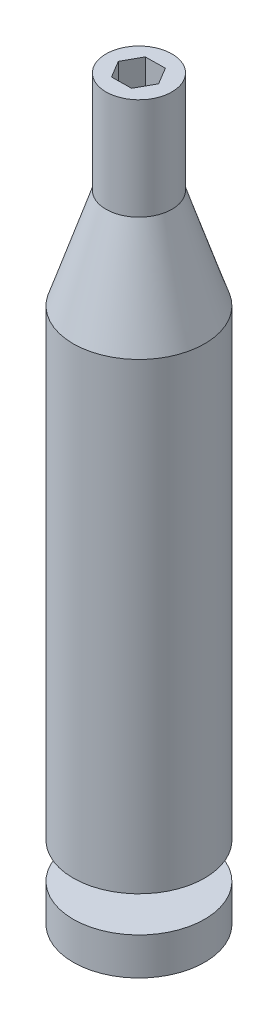
ISO-10303-21;
HEADER;
FILE_DESCRIPTION(('STEP AP214'),'2;1');
FILE_NAME('part.step','',(''),(''),'','','');
FILE_SCHEMA(('AUTOMOTIVE_DESIGN { 1 0 10303 214 1 1 1 1 }'));
ENDSEC;
DATA;
#1=APPLICATION_CONTEXT('core data for automotive mechanical design processes');
#2=APPLICATION_PROTOCOL_DEFINITION('international standard','automotive_design',2000,#1);
#3=PRODUCT_CONTEXT('',#1,'mechanical');
#4=PRODUCT('Part','Part','',(#3));
#5=PRODUCT_RELATED_PRODUCT_CATEGORY('part','',(#4));
#6=PRODUCT_DEFINITION_FORMATION('','',#4);
#7=PRODUCT_DEFINITION_CONTEXT('part definition',#1,'design');
#8=PRODUCT_DEFINITION('design','',#6,#7);
#9=PRODUCT_DEFINITION_SHAPE('','',#8);
#10=(LENGTH_UNIT() NAMED_UNIT(*) SI_UNIT(.MILLI.,.METRE.));
#11=(NAMED_UNIT(*) PLANE_ANGLE_UNIT() SI_UNIT($,.RADIAN.));
#12=(NAMED_UNIT(*) SI_UNIT($,.STERADIAN.) SOLID_ANGLE_UNIT());
#13=UNCERTAINTY_MEASURE_WITH_UNIT(LENGTH_MEASURE(1.E-05),#10,'distance_accuracy_value','');
#14=(GEOMETRIC_REPRESENTATION_CONTEXT(3) GLOBAL_UNCERTAINTY_ASSIGNED_CONTEXT((#13)) GLOBAL_UNIT_ASSIGNED_CONTEXT((#10,
#11,#12)) REPRESENTATION_CONTEXT('',''));
#15=CARTESIAN_POINT('',(0.,0.,0.));
#16=DIRECTION('',(0.,0.,1.));
#17=DIRECTION('',(1.,0.,0.));
#18=AXIS2_PLACEMENT_3D('',#15,#16,#17);
#19=CARTESIAN_POINT('',(0.,-70.3453569178805,0.));
#20=DIRECTION('',(0.,-1.,0.));
#21=DIRECTION('',(0.,0.,-1.));
#22=AXIS2_PLACEMENT_3D('',#19,#20,#21);
#23=PLANE('',#22);
#24=CARTESIAN_POINT('',(-35.1618275784359,-70.3453569178805,0.));
#25=DIRECTION('',(0.,1.,0.));
#26=DIRECTION('',(0.,0.,1.));
#27=AXIS2_PLACEMENT_3D('',#24,#25,#26);
#28=CIRCLE('',#27,1.29726463423902);
#29=CARTESIAN_POINT('',(-35.1618275784359,-70.3453569178805,1.29726463423902));
#30=VERTEX_POINT('',#29);
#31=EDGE_CURVE('E71',#30,#30,#28,.T.);
#32=ORIENTED_EDGE('',*,*,#31,.T.);
#33=EDGE_LOOP('',(#32));
#34=FACE_BOUND('',#33,.T.);
#35=ADVANCED_FACE('F49',(#34),#23,.F.);
#36=CARTESIAN_POINT('',(0.,-119.615434083961,0.));
#37=DIRECTION('',(0.,-1.,0.));
#38=DIRECTION('',(0.,0.,-1.));
#39=AXIS2_PLACEMENT_3D('',#36,#37,#38);
#40=PLANE('',#39);
#41=CARTESIAN_POINT('',(-35.1618275784359,-119.615434083961,0.));
#42=DIRECTION('',(0.,1.,0.));
#43=DIRECTION('',(0.,0.,1.));
#44=AXIS2_PLACEMENT_3D('',#41,#42,#43);
#45=CIRCLE('',#44,10.9373759724036);
#46=CARTESIAN_POINT('',(-35.1618275784359,-119.615434083961,10.9373759724036));
#47=VERTEX_POINT('',#46);
#48=EDGE_CURVE('E11',#47,#47,#45,.T.);
#49=ORIENTED_EDGE('',*,*,#48,.F.);
#50=EDGE_LOOP('',(#49));
#51=FACE_BOUND('',#50,.T.);
#52=ADVANCED_FACE('F101',(#51),#40,.T.);
#53=CARTESIAN_POINT('',(-35.1618275784359,36.0557723473792,0.));
#54=DIRECTION('',(0.,1.,0.));
#55=DIRECTION('',(0.,0.,1.));
#56=AXIS2_PLACEMENT_3D('',#53,#54,#55);
#57=CYLINDRICAL_SURFACE('',#56,10.9373759724036);
#58=ORIENTED_EDGE('',*,*,#48,.T.);
#59=EDGE_LOOP('',(#58));
#60=FACE_BOUND('',#59,.T.);
#61=CARTESIAN_POINT('',(-35.1618275784359,-113.408967551433,0.));
#62=DIRECTION('',(0.,1.,0.));
#63=DIRECTION('',(0.,0.,1.));
#64=AXIS2_PLACEMENT_3D('',#61,#62,#63);
#65=CIRCLE('',#64,10.9373759724036);
#66=CARTESIAN_POINT('',(-35.1618275784359,-113.408967551433,10.9373759724036));
#67=VERTEX_POINT('',#66);
#68=EDGE_CURVE('E55',#67,#67,#65,.T.);
#69=ORIENTED_EDGE('',*,*,#68,.F.);
#70=EDGE_LOOP('',(#69));
#71=FACE_BOUND('',#70,.T.);
#72=ADVANCED_FACE('F96',(#60,#71),#57,.T.);
#73=CARTESIAN_POINT('',(1.76362048735651E-13,-113.408967551433,0.));
#74=DIRECTION('',(0.,-1.,0.));
#75=DIRECTION('',(0.,0.,-1.));
#76=AXIS2_PLACEMENT_3D('',#73,#74,#75);
#77=PLANE('',#76);
#78=CARTESIAN_POINT('',(-35.1618275784359,-113.408967551433,0.));
#79=DIRECTION('',(0.,1.,0.));
#80=DIRECTION('',(0.,0.,1.));
#81=AXIS2_PLACEMENT_3D('',#78,#79,#80);
#82=CIRCLE('',#81,2.01331550437638);
#83=CARTESIAN_POINT('',(-35.1618275784359,-113.408967551433,2.01331550437638));
#84=VERTEX_POINT('',#83);
#85=EDGE_CURVE('E59',#84,#84,#82,.T.);
#86=ORIENTED_EDGE('',*,*,#85,.F.);
#87=EDGE_LOOP('',(#86));
#88=FACE_BOUND('',#87,.T.);
#89=ORIENTED_EDGE('',*,*,#68,.T.);
#90=EDGE_LOOP('',(#89));
#91=FACE_BOUND('',#90,.T.);
#92=ADVANCED_FACE('F91',(#88,#91),#77,.F.);
#93=CARTESIAN_POINT('',(-35.1618275784359,36.0557723473792,0.));
#94=DIRECTION('',(0.,1.,0.));
#95=DIRECTION('',(0.,0.,1.));
#96=AXIS2_PLACEMENT_3D('',#93,#94,#95);
#97=CYLINDRICAL_SURFACE('',#96,2.01331550437637);
#98=CARTESIAN_POINT('',(-35.1618275784359,-75.528254617628,0.));
#99=DIRECTION('',(0.,1.,0.));
#100=DIRECTION('',(0.,0.,1.));
#101=AXIS2_PLACEMENT_3D('',#98,#99,#100);
#102=CIRCLE('',#101,2.01331550437637);
#103=CARTESIAN_POINT('',(-35.1618275784359,-75.5282546176281,2.01331550437636));
#104=VERTEX_POINT('',#103);
#105=EDGE_CURVE('E63',#104,#104,#102,.T.);
#106=ORIENTED_EDGE('',*,*,#105,.F.);
#107=EDGE_LOOP('',(#106));
#108=FACE_BOUND('',#107,.T.);
#109=ORIENTED_EDGE('',*,*,#85,.T.);
#110=EDGE_LOOP('',(#109));
#111=FACE_BOUND('',#110,.T.);
#112=ADVANCED_FACE('F85',(#108,#111),#97,.T.);
#113=CARTESIAN_POINT('',(-35.1618275784359,-75.528254617628,0.));
#114=DIRECTION('',(0.,1.,0.));
#115=DIRECTION('',(0.,0.,1.));
#116=AXIS2_PLACEMENT_3D('',#113,#114,#115);
#117=CONICAL_SURFACE('',#116,2.01331550437637,0.904722407207791);
#118=CARTESIAN_POINT('',(-35.1618275784359,-71.8554377448549,0.));
#119=DIRECTION('',(0.,1.,0.));
#120=DIRECTION('',(0.,0.,1.));
#121=AXIS2_PLACEMENT_3D('',#118,#119,#120);
#122=CIRCLE('',#121,6.68680256993768);
#123=CARTESIAN_POINT('',(-35.1618275784359,-71.8554377448549,6.68680256993767));
#124=VERTEX_POINT('',#123);
#125=EDGE_CURVE('E68',#124,#124,#122,.T.);
#126=CARTESIAN_POINT('',(-35.1618275784359,-71.8554377448549,6.68680256993767));
#127=CARTESIAN_POINT('',(-35.1618275784359,-71.8936962539463,6.63812041300473));
#128=CARTESIAN_POINT('',(-35.1618275784359,-71.9319547630377,6.58943825607181));
#129=CARTESIAN_POINT('',(-35.1618275784359,-72.0084717812205,6.49207394220595));
#130=CARTESIAN_POINT('',(-35.1618275784359,-72.0467302903119,6.44339178527302));
#131=CARTESIAN_POINT('',(-35.1618275784359,-72.1232473084946,6.34602747140716));
#132=CARTESIAN_POINT('',(-35.1618275784359,-72.161505817586,6.29734531447422));
#133=CARTESIAN_POINT('',(-35.1618275784359,-72.2380228357688,6.19998100060836));
#134=CARTESIAN_POINT('',(-35.1618275784359,-72.2762813448602,6.15129884367543));
#135=CARTESIAN_POINT('',(-35.1618275784359,-72.352798363043,6.05393452980957));
#136=CARTESIAN_POINT('',(-35.1618275784359,-72.3910568721343,6.00525237287664));
#137=CARTESIAN_POINT('',(-35.1618275784359,-72.4675738903171,5.90788805901078));
#138=CARTESIAN_POINT('',(-35.1618275784359,-72.5058323994085,5.85920590207785));
#139=CARTESIAN_POINT('',(-35.1618275784359,-72.5823494175913,5.76184158821199));
#140=CARTESIAN_POINT('',(-35.1618275784359,-72.6206079266827,5.71315943127906));
#141=CARTESIAN_POINT('',(-35.1618275784359,-72.6971249448654,5.6157951174132));
#142=CARTESIAN_POINT('',(-35.1618275784359,-72.7353834539568,5.56711296048027));
#143=CARTESIAN_POINT('',(-35.1618275784359,-72.8119004721396,5.46974864661441));
#144=CARTESIAN_POINT('',(-35.1618275784359,-72.850158981231,5.42106648968148));
#145=CARTESIAN_POINT('',(-35.1618275784359,-72.9266759994138,5.32370217581562));
#146=CARTESIAN_POINT('',(-35.1618275784359,-72.9649345085051,5.27502001888269));
#147=CARTESIAN_POINT('',(-35.1618275784359,-73.0414515266879,5.17765570501683));
#148=CARTESIAN_POINT('',(-35.1618275784359,-73.0797100357793,5.1289735480839));
#149=CARTESIAN_POINT('',(-35.1618275784359,-73.1562270539621,5.03160923421804));
#150=CARTESIAN_POINT('',(-35.1618275784359,-73.1944855630534,4.98292707728511));
#151=CARTESIAN_POINT('',(-35.1618275784359,-73.2710025812362,4.88556276341925));
#152=CARTESIAN_POINT('',(-35.1618275784359,-73.3092610903276,4.83688060648631));
#153=CARTESIAN_POINT('',(-35.1618275784359,-73.3857781085104,4.73951629262045));
#154=CARTESIAN_POINT('',(-35.1618275784359,-73.4240366176018,4.69083413568753));
#155=CARTESIAN_POINT('',(-35.1618275784359,-73.5005536357845,4.59346982182167));
#156=CARTESIAN_POINT('',(-35.1618275784359,-73.5388121448759,4.54478766488873));
#157=CARTESIAN_POINT('',(-35.1618275784359,-73.6153291630587,4.44742335102287));
#158=CARTESIAN_POINT('',(-35.1618275784359,-73.6535876721501,4.39874119408994));
#159=CARTESIAN_POINT('',(-35.1618275784359,-73.7301046903329,4.30137688022408));
#160=CARTESIAN_POINT('',(-35.1618275784359,-73.7683631994243,4.25269472329115));
#161=CARTESIAN_POINT('',(-35.1618275784359,-73.844880217607,4.15533040942529));
#162=CARTESIAN_POINT('',(-35.1618275784359,-73.8831387266984,4.10664825249236));
#163=CARTESIAN_POINT('',(-35.1618275784359,-73.9596557448812,4.0092839386265));
#164=CARTESIAN_POINT('',(-35.1618275784359,-73.9979142539726,3.96060178169357));
#165=CARTESIAN_POINT('',(-35.1618275784359,-74.0744312721554,3.86323746782771));
#166=CARTESIAN_POINT('',(-35.1618275784359,-74.1126897812467,3.81455531089478));
#167=CARTESIAN_POINT('',(-35.1618275784359,-74.1892067994295,3.71719099702892));
#168=CARTESIAN_POINT('',(-35.1618275784359,-74.2274653085209,3.66850884009599));
#169=CARTESIAN_POINT('',(-35.1618275784359,-74.3039823267037,3.57114452623013));
#170=CARTESIAN_POINT('',(-35.1618275784359,-74.3422408357951,3.5224623692972));
#171=CARTESIAN_POINT('',(-35.1618275784359,-74.4187578539778,3.42509805543134));
#172=CARTESIAN_POINT('',(-35.1618275784359,-74.4570163630692,3.37641589849841));
#173=CARTESIAN_POINT('',(-35.1618275784359,-74.533533381252,3.27905158463255));
#174=CARTESIAN_POINT('',(-35.1618275784359,-74.5717918903434,3.23036942769962));
#175=CARTESIAN_POINT('',(-35.1618275784359,-74.6483089085261,3.13300511383376));
#176=CARTESIAN_POINT('',(-35.1618275784359,-74.6865674176175,3.08432295690083));
#177=CARTESIAN_POINT('',(-35.1618275784359,-74.7630844358003,2.98695864303497));
#178=CARTESIAN_POINT('',(-35.1618275784359,-74.8013429448917,2.93827648610203));
#179=CARTESIAN_POINT('',(-35.1618275784359,-74.8778599630745,2.84091217223617));
#180=CARTESIAN_POINT('',(-35.1618275784359,-74.9161184721658,2.79223001530325));
#181=CARTESIAN_POINT('',(-35.1618275784359,-74.9926354903486,2.69486570143738));
#182=CARTESIAN_POINT('',(-35.1618275784359,-75.03089399944,2.64618354450445));
#183=CARTESIAN_POINT('',(-35.1618275784359,-75.1074110176228,2.54881923063859));
#184=CARTESIAN_POINT('',(-35.1618275784359,-75.1456695267142,2.50013707370566));
#185=CARTESIAN_POINT('',(-35.1618275784359,-75.2221865448969,2.4027727598398));
#186=CARTESIAN_POINT('',(-35.1618275784359,-75.2604450539883,2.35409060290687));
#187=CARTESIAN_POINT('',(-35.1618275784359,-75.3369620721711,2.25672628904101));
#188=CARTESIAN_POINT('',(-35.1618275784359,-75.3752205812625,2.20804413210808));
#189=CARTESIAN_POINT('',(-35.1618275784359,-75.4517375994453,2.11067981824222));
#190=CARTESIAN_POINT('',(-35.1618275784359,-75.4899961085367,2.06199766130929));
#191=CARTESIAN_POINT('',(-35.1618275784359,-75.5282546176281,2.01331550437636));
#192=B_SPLINE_CURVE_WITH_KNOTS('',3,(#126,#127,#128,#129,#130,#131,#132,#133,#134,#135,#136,
#137,#138,#139,#140,#141,#142,#143,#144,#145,#146,#147,#148,#149,#150,#151,#152,#153,#154,#155,
#156,#157,#158,#159,#160,#161,#162,#163,#164,#165,#166,#167,#168,#169,#170,#171,#172,#173,#174,
#175,#176,#177,#178,#179,#180,#181,#182,#183,#184,#185,#186,#187,#188,#189,#190,#191),
.UNSPECIFIED.,.F.,.F.,(4,2,2,2,2,2,2,2,2,2,2,2,2,2,2,2,2,2,2,2,2,2,2,2,2,2,2,2,2,2,2,2,4),(0.,
0.185749813711467,0.371499627422935,0.557249441134394,0.742999254845862,0.928749068557321,
1.11449888226879,1.30024869598025,1.48599850969172,1.67174832340317,1.85749813711464,
2.0432479508261,2.22899776453757,2.41474757824903,2.6004973919605,2.78624720567195,
2.97199701938342,3.15774683309489,3.34349664680635,3.52924646051782,3.71499627422928,
3.90074608794074,4.0864959016522,4.27224571536367,4.45799552907513,4.6437453427866,
4.82949515649806,5.01524497020952,5.20099478392098,5.38674459763245,5.57249441134391,
5.75824422505538,5.94399403876685),.UNSPECIFIED.);
#193=EDGE_CURVE('BSEAM79',#124,#104,#192,.T.);
#194=ORIENTED_EDGE('',*,*,#125,.F.);
#195=ORIENTED_EDGE('',*,*,#105,.T.);
#196=ORIENTED_EDGE('',*,*,#193,.T.);
#197=ORIENTED_EDGE('',*,*,#193,.F.);
#198=EDGE_LOOP('',(#194,#196,#195,#197));
#199=FACE_BOUND('',#198,.T.);
#200=ADVANCED_FACE('F79',(#199),#117,.T.);
#201=CARTESIAN_POINT('',(-35.1618275784359,-71.8554377448549,0.));
#202=DIRECTION('',(0.,-1.,0.));
#203=DIRECTION('',(0.,0.,-1.));
#204=AXIS2_PLACEMENT_3D('',#201,#202,#203);
#205=CONICAL_SURFACE('',#204,6.68680256993768,1.29761382083464);
#206=ORIENTED_EDGE('',*,*,#31,.F.);
#207=EDGE_LOOP('',(#206));
#208=FACE_BOUND('',#207,.T.);
#209=ORIENTED_EDGE('',*,*,#125,.T.);
#210=EDGE_LOOP('',(#209));
#211=FACE_BOUND('',#210,.T.);
#212=ADVANCED_FACE('F76',(#208,#211),#205,.T.);
#213=CLOSED_SHELL('',(#35,#52,#72,#92,#112,#200,#212));
#214=MANIFOLD_SOLID_BREP('B2',#213);
#215=CARTESIAN_POINT('',(0.,3.056095738458,0.));
#216=DIRECTION('',(0.,1.,0.));
#217=DIRECTION('',(0.,0.,1.));
#218=AXIS2_PLACEMENT_3D('',#215,#216,#217);
#219=PLANE('',#218);
#220=DIRECTION('',(0.99988162135693,0.,-0.015386463941932));
#221=VECTOR('',#220,1.);
#222=CARTESIAN_POINT('',(-36.8516216289522,3.056095738458,2.87954702777112));
#223=LINE('',#222,#221);
#224=CARTESIAN_POINT('',(-36.8516216289522,3.056095738458,2.87954702777112));
#225=VERTEX_POINT('',#224);
#226=CARTESIAN_POINT('',(-33.5558878445239,3.056095738458,2.82883133507992));
#227=VERTEX_POINT('',#226);
#228=EDGE_CURVE('E165',#225,#227,#223,.T.);
#229=ORIENTED_EDGE('',*,*,#228,.F.);
#230=DIRECTION('',(0.513265879326592,0.,0.858229652901308));
#231=VECTOR('',#230,1.);
#232=CARTESIAN_POINT('',(-38.5434095994074,3.056095738458,0.0507156926911954));
#233=LINE('',#232,#231);
#234=CARTESIAN_POINT('',(-38.5434095994074,3.056095738458,0.0507156926911954));
#235=VERTEX_POINT('',#234);
#236=EDGE_CURVE('E258',#235,#225,#233,.T.);
#237=ORIENTED_EDGE('',*,*,#236,.F.);
#238=DIRECTION('',(-0.486615742030338,0.,0.873616116843241));
#239=VECTOR('',#238,1.);
#240=CARTESIAN_POINT('',(-36.9394637854344,3.056095738458,-2.82883133507992));
#241=LINE('',#240,#239);
#242=CARTESIAN_POINT('',(-36.9394637854344,3.056095738458,-2.82883133507992));
#243=VERTEX_POINT('',#242);
#244=EDGE_CURVE('E255',#243,#235,#241,.T.);
#245=ORIENTED_EDGE('',*,*,#244,.F.);
#246=DIRECTION('',(-0.99988162135693,0.,0.0153864639419317));
#247=VECTOR('',#246,1.);
#248=CARTESIAN_POINT('',(-33.6437300010061,3.056095738458,-2.87954702777111));
#249=LINE('',#248,#247);
#250=CARTESIAN_POINT('',(-33.6437300010061,3.056095738458,-2.87954702777111));
#251=VERTEX_POINT('',#250);
#252=EDGE_CURVE('E213',#251,#243,#249,.T.);
#253=ORIENTED_EDGE('',*,*,#252,.F.);
#254=DIRECTION('',(-0.513265879326591,0.,-0.858229652901309));
#255=VECTOR('',#254,1.);
#256=CARTESIAN_POINT('',(-31.9519420305508,3.056095738458,-0.0507156926911958));
#257=LINE('',#256,#255);
#258=CARTESIAN_POINT('',(-31.9519420305508,3.056095738458,-0.0507156926911958));
#259=VERTEX_POINT('',#258);
#260=EDGE_CURVE('E249',#259,#251,#257,.T.);
#261=ORIENTED_EDGE('',*,*,#260,.F.);
#262=DIRECTION('',(0.486615742030338,0.,-0.873616116843241));
#263=VECTOR('',#262,1.);
#264=CARTESIAN_POINT('',(-33.5558878445239,3.056095738458,2.82883133507992));
#265=LINE('',#264,#263);
#266=EDGE_CURVE('E245',#227,#259,#265,.T.);
#267=ORIENTED_EDGE('',*,*,#266,.F.);
#268=EDGE_LOOP('',(#229,#237,#245,#253,#261,#267));
#269=FACE_BOUND('',#268,.T.);
#270=CARTESIAN_POINT('',(-35.1618275784359,3.056095738458,0.));
#271=DIRECTION('',(0.,1.,0.));
#272=DIRECTION('',(0.,0.,1.));
#273=AXIS2_PLACEMENT_3D('',#270,#271,#272);
#274=CIRCLE('',#273,5.48110614394984);
#275=CARTESIAN_POINT('',(-35.1618275784359,3.056095738458,5.48110614394984));
#276=VERTEX_POINT('',#275);
#277=EDGE_CURVE('E264',#276,#276,#274,.T.);
#278=ORIENTED_EDGE('',*,*,#277,.T.);
#279=EDGE_LOOP('',(#278));
#280=FACE_BOUND('',#279,.T.);
#281=ADVANCED_FACE('F150',(#269,#280),#219,.T.);
#282=CARTESIAN_POINT('',(0.,-68.992528565953,0.));
#283=DIRECTION('',(0.,-1.,0.));
#284=DIRECTION('',(0.,0.,-1.));
#285=AXIS2_PLACEMENT_3D('',#282,#283,#284);
#286=PLANE('',#285);
#287=CARTESIAN_POINT('',(-35.1618275784359,-68.992528565953,0.));
#288=DIRECTION('',(0.,1.,0.));
#289=DIRECTION('',(0.,0.,1.));
#290=AXIS2_PLACEMENT_3D('',#287,#288,#289);
#291=CIRCLE('',#290,8.20924105817507);
#292=CARTESIAN_POINT('',(-35.1618275784359,-68.992528565953,8.20924105817507));
#293=VERTEX_POINT('',#292);
#294=EDGE_CURVE('E47',#293,#293,#291,.T.);
#295=ORIENTED_EDGE('',*,*,#294,.F.);
#296=EDGE_LOOP('',(#295));
#297=FACE_BOUND('',#296,.T.);
#298=ADVANCED_FACE('F305',(#297),#286,.T.);
#299=CARTESIAN_POINT('',(-35.1618275784359,36.0557723473792,0.));
#300=DIRECTION('',(0.,1.,0.));
#301=DIRECTION('',(0.,0.,1.));
#302=AXIS2_PLACEMENT_3D('',#299,#300,#301);
#303=CYLINDRICAL_SURFACE('',#302,8.20924105817507);
#304=ORIENTED_EDGE('',*,*,#294,.T.);
#305=EDGE_LOOP('',(#304));
#306=FACE_BOUND('',#305,.T.);
#307=CARTESIAN_POINT('',(-35.1618275784359,-74.7118923478266,0.));
#308=DIRECTION('',(0.,1.,0.));
#309=DIRECTION('',(0.,0.,1.));
#310=AXIS2_PLACEMENT_3D('',#307,#308,#309);
#311=CIRCLE('',#310,8.20924105817507);
#312=CARTESIAN_POINT('',(-35.1618275784359,-74.7118923478266,8.20924105817507));
#313=VERTEX_POINT('',#312);
#314=EDGE_CURVE('E158',#313,#313,#311,.T.);
#315=ORIENTED_EDGE('',*,*,#314,.F.);
#316=EDGE_LOOP('',(#315));
#317=FACE_BOUND('',#316,.T.);
#318=ADVANCED_FACE('F303',(#306,#317),#303,.F.);
#319=CARTESIAN_POINT('',(0.,-74.7118923478266,0.));
#320=DIRECTION('',(0.,1.,0.));
#321=DIRECTION('',(0.,0.,1.));
#322=AXIS2_PLACEMENT_3D('',#319,#320,#321);
#323=PLANE('',#322);
#324=ORIENTED_EDGE('',*,*,#314,.T.);
#325=EDGE_LOOP('',(#324));
#326=FACE_BOUND('',#325,.T.);
#327=CARTESIAN_POINT('',(-35.1618275784359,-74.7118923478266,0.));
#328=DIRECTION('',(0.,1.,0.));
#329=DIRECTION('',(0.,0.,1.));
#330=AXIS2_PLACEMENT_3D('',#327,#328,#329);
#331=CIRCLE('',#330,5.48110614394983);
#332=CARTESIAN_POINT('',(-35.1618275784359,-74.7118923478266,5.48110614394983));
#333=VERTEX_POINT('',#332);
#334=EDGE_CURVE('E293',#333,#333,#331,.T.);
#335=ORIENTED_EDGE('',*,*,#334,.F.);
#336=EDGE_LOOP('',(#335));
#337=FACE_BOUND('',#336,.T.);
#338=ADVANCED_FACE('F300',(#326,#337),#323,.T.);
#339=CARTESIAN_POINT('',(-35.1618275784359,36.0557723473792,0.));
#340=DIRECTION('',(0.,1.,0.));
#341=DIRECTION('',(0.,0.,1.));
#342=AXIS2_PLACEMENT_3D('',#339,#340,#341);
#343=CYLINDRICAL_SURFACE('',#342,5.48110614394983);
#344=ORIENTED_EDGE('',*,*,#334,.T.);
#345=EDGE_LOOP('',(#344));
#346=FACE_BOUND('',#345,.T.);
#347=CARTESIAN_POINT('',(-35.1618275784359,-107.485093425392,0.));
#348=DIRECTION('',(0.,1.,0.));
#349=DIRECTION('',(0.,0.,1.));
#350=AXIS2_PLACEMENT_3D('',#347,#348,#349);
#351=CIRCLE('',#350,5.48110614394983);
#352=CARTESIAN_POINT('',(-35.1618275784359,-107.485093425392,5.48110614394983));
#353=VERTEX_POINT('',#352);
#354=EDGE_CURVE('E289',#353,#353,#351,.T.);
#355=ORIENTED_EDGE('',*,*,#354,.F.);
#356=EDGE_LOOP('',(#355));
#357=FACE_BOUND('',#356,.T.);
#358=ADVANCED_FACE('F312',(#346,#357),#343,.F.);
#359=CARTESIAN_POINT('',(0.,-107.485093425392,0.));
#360=DIRECTION('',(0.,-1.,0.));
#361=DIRECTION('',(0.,0.,-1.));
#362=AXIS2_PLACEMENT_3D('',#359,#360,#361);
#363=PLANE('',#362);
#364=ORIENTED_EDGE('',*,*,#354,.T.);
#365=EDGE_LOOP('',(#364));
#366=FACE_BOUND('',#365,.T.);
#367=CARTESIAN_POINT('',(-35.1618275784359,-107.485093425392,0.));
#368=DIRECTION('',(0.,1.,0.));
#369=DIRECTION('',(0.,0.,1.));
#370=AXIS2_PLACEMENT_3D('',#367,#368,#369);
#371=CIRCLE('',#370,10.9373759724003);
#372=CARTESIAN_POINT('',(-35.1618275784359,-107.485093425392,10.9373759724003));
#373=VERTEX_POINT('',#372);
#374=EDGE_CURVE('E285',#373,#373,#371,.T.);
#375=ORIENTED_EDGE('',*,*,#374,.F.);
#376=EDGE_LOOP('',(#375));
#377=FACE_BOUND('',#376,.T.);
#378=ADVANCED_FACE('F343',(#366,#377),#363,.T.);
#379=CARTESIAN_POINT('',(-35.1618275784359,36.0557723473792,0.));
#380=DIRECTION('',(0.,1.,0.));
#381=DIRECTION('',(0.,0.,1.));
#382=AXIS2_PLACEMENT_3D('',#379,#380,#381);
#383=CYLINDRICAL_SURFACE('',#382,10.9373759724003);
#384=ORIENTED_EDGE('',*,*,#374,.T.);
#385=EDGE_LOOP('',(#384));
#386=FACE_BOUND('',#385,.T.);
#387=CARTESIAN_POINT('',(-35.1618275784359,-30.4999637065099,0.));
#388=DIRECTION('',(0.,1.,0.));
#389=DIRECTION('',(0.,0.,1.));
#390=AXIS2_PLACEMENT_3D('',#387,#388,#389);
#391=CIRCLE('',#390,10.9373759724003);
#392=CARTESIAN_POINT('',(-35.1618275784359,-30.4999637065099,10.9373759724003));
#393=VERTEX_POINT('',#392);
#394=EDGE_CURVE('E281',#393,#393,#391,.T.);
#395=ORIENTED_EDGE('',*,*,#394,.F.);
#396=EDGE_LOOP('',(#395));
#397=FACE_BOUND('',#396,.T.);
#398=ADVANCED_FACE('F336',(#386,#397),#383,.T.);
#399=CARTESIAN_POINT('',(-35.1618275784359,-13.858340729736,0.));
#400=DIRECTION('',(0.,-1.,0.));
#401=DIRECTION('',(0.,0.,-1.));
#402=AXIS2_PLACEMENT_3D('',#399,#400,#401);
#403=CONICAL_SURFACE('',#402,5.48110614394984,0.31682448586822);
#404=ORIENTED_EDGE('',*,*,#394,.T.);
#405=EDGE_LOOP('',(#404));
#406=FACE_BOUND('',#405,.T.);
#407=CARTESIAN_POINT('',(-35.1618275784359,-13.858340729736,0.));
#408=DIRECTION('',(0.,1.,0.));
#409=DIRECTION('',(0.,0.,1.));
#410=AXIS2_PLACEMENT_3D('',#407,#408,#409);
#411=CIRCLE('',#410,5.48110614394984);
#412=CARTESIAN_POINT('',(-35.1618275784359,-13.858340729736,5.48110614394984));
#413=VERTEX_POINT('',#412);
#414=EDGE_CURVE('E277',#413,#413,#411,.T.);
#415=ORIENTED_EDGE('',*,*,#414,.F.);
#416=EDGE_LOOP('',(#415));
#417=FACE_BOUND('',#416,.T.);
#418=ADVANCED_FACE('F327',(#406,#417),#403,.T.);
#419=CARTESIAN_POINT('',(-35.1618275784359,36.0557723473792,0.));
#420=DIRECTION('',(0.,1.,0.));
#421=DIRECTION('',(0.,0.,1.));
#422=AXIS2_PLACEMENT_3D('',#419,#420,#421);
#423=CYLINDRICAL_SURFACE('',#422,5.48110614394984);
#424=ORIENTED_EDGE('',*,*,#414,.T.);
#425=EDGE_LOOP('',(#424));
#426=FACE_BOUND('',#425,.T.);
#427=ORIENTED_EDGE('',*,*,#277,.F.);
#428=EDGE_LOOP('',(#427));
#429=FACE_BOUND('',#428,.T.);
#430=ADVANCED_FACE('F324',(#426,#429),#423,.T.);
#431=CARTESIAN_POINT('',(-36.8516216289522,-6.943904261542,2.87954702777112));
#432=DIRECTION('',(0.015386463941932,0.,0.99988162135693));
#433=DIRECTION('',(0.99988162135693,0.,-0.015386463941932));
#434=AXIS2_PLACEMENT_3D('',#431,#432,#433);
#435=PLANE('',#434);
#436=ORIENTED_EDGE('',*,*,#228,.T.);
#437=DIRECTION('',(0.,1.,0.));
#438=VECTOR('',#437,1.);
#439=CARTESIAN_POINT('',(-33.5558878445239,-6.943904261542,2.82883133507992));
#440=LINE('',#439,#438);
#441=CARTESIAN_POINT('',(-33.5558878445239,-6.943904261542,2.82883133507992));
#442=VERTEX_POINT('',#441);
#443=EDGE_CURVE('E195',#442,#227,#440,.T.);
#444=ORIENTED_EDGE('',*,*,#443,.F.);
#445=DIRECTION('',(0.99988162135693,0.,-0.015386463941932));
#446=VECTOR('',#445,1.);
#447=CARTESIAN_POINT('',(-36.8516216289522,-6.943904261542,2.87954702777112));
#448=LINE('',#447,#446);
#449=CARTESIAN_POINT('',(-36.8516216289522,-6.943904261542,2.87954702777112));
#450=VERTEX_POINT('',#449);
#451=EDGE_CURVE('E261',#450,#442,#448,.T.);
#452=ORIENTED_EDGE('',*,*,#451,.F.);
#453=DIRECTION('',(0.,1.,0.));
#454=VECTOR('',#453,1.);
#455=CARTESIAN_POINT('',(-36.8516216289522,-6.943904261542,2.87954702777112));
#456=LINE('',#455,#454);
#457=EDGE_CURVE('E173',#450,#225,#456,.T.);
#458=ORIENTED_EDGE('',*,*,#457,.T.);
#459=EDGE_LOOP('',(#436,#444,#452,#458));
#460=FACE_BOUND('',#459,.T.);
#461=ADVANCED_FACE('F326',(#460),#435,.F.);
#462=CARTESIAN_POINT('',(-38.5434095994074,-6.943904261542,0.0507156926911954));
#463=DIRECTION('',(-0.858229652901308,0.,0.513265879326592));
#464=DIRECTION('',(0.513265879326592,0.,0.858229652901308));
#465=AXIS2_PLACEMENT_3D('',#462,#463,#464);
#466=PLANE('',#465);
#467=ORIENTED_EDGE('',*,*,#236,.T.);
#468=ORIENTED_EDGE('',*,*,#457,.F.);
#469=DIRECTION('',(0.513265879326592,0.,0.858229652901308));
#470=VECTOR('',#469,1.);
#471=CARTESIAN_POINT('',(-38.5434095994074,-6.943904261542,0.0507156926911954));
#472=LINE('',#471,#470);
#473=CARTESIAN_POINT('',(-38.5434095994074,-6.943904261542,0.0507156926911954));
#474=VERTEX_POINT('',#473);
#475=EDGE_CURVE('E227',#474,#450,#472,.T.);
#476=ORIENTED_EDGE('',*,*,#475,.F.);
#477=DIRECTION('',(0.,1.,0.));
#478=VECTOR('',#477,1.);
#479=CARTESIAN_POINT('',(-38.5434095994074,-6.943904261542,0.0507156926911954));
#480=LINE('',#479,#478);
#481=EDGE_CURVE('E218',#474,#235,#480,.T.);
#482=ORIENTED_EDGE('',*,*,#481,.T.);
#483=EDGE_LOOP('',(#467,#468,#476,#482));
#484=FACE_BOUND('',#483,.T.);
#485=ADVANCED_FACE('F334',(#484),#466,.F.);
#486=CARTESIAN_POINT('',(-36.9394637854344,-6.943904261542,-2.82883133507992));
#487=DIRECTION('',(-0.873616116843241,0.,-0.486615742030338));
#488=DIRECTION('',(-0.486615742030338,0.,0.873616116843241));
#489=AXIS2_PLACEMENT_3D('',#486,#487,#488);
#490=PLANE('',#489);
#491=ORIENTED_EDGE('',*,*,#244,.T.);
#492=ORIENTED_EDGE('',*,*,#481,.F.);
#493=DIRECTION('',(-0.486615742030338,0.,0.873616116843241));
#494=VECTOR('',#493,1.);
#495=CARTESIAN_POINT('',(-36.9394637854344,-6.943904261542,-2.82883133507992));
#496=LINE('',#495,#494);
#497=CARTESIAN_POINT('',(-36.9394637854344,-6.943904261542,-2.82883133507992));
#498=VERTEX_POINT('',#497);
#499=EDGE_CURVE('E222',#498,#474,#496,.T.);
#500=ORIENTED_EDGE('',*,*,#499,.F.);
#501=DIRECTION('',(0.,1.,0.));
#502=VECTOR('',#501,1.);
#503=CARTESIAN_POINT('',(-36.9394637854344,-6.943904261542,-2.82883133507992));
#504=LINE('',#503,#502);
#505=EDGE_CURVE('E206',#498,#243,#504,.T.);
#506=ORIENTED_EDGE('',*,*,#505,.T.);
#507=EDGE_LOOP('',(#491,#492,#500,#506));
#508=FACE_BOUND('',#507,.T.);
#509=ADVANCED_FACE('F223',(#508),#490,.F.);
#510=CARTESIAN_POINT('',(-33.6437300010061,-6.943904261542,-2.87954702777111));
#511=DIRECTION('',(-0.0153864639419317,0.,-0.99988162135693));
#512=DIRECTION('',(-0.99988162135693,0.,0.0153864639419317));
#513=AXIS2_PLACEMENT_3D('',#510,#511,#512);
#514=PLANE('',#513);
#515=ORIENTED_EDGE('',*,*,#252,.T.);
#516=ORIENTED_EDGE('',*,*,#505,.F.);
#517=DIRECTION('',(-0.99988162135693,0.,0.0153864639419317));
#518=VECTOR('',#517,1.);
#519=CARTESIAN_POINT('',(-33.6437300010061,-6.943904261542,-2.87954702777111));
#520=LINE('',#519,#518);
#521=CARTESIAN_POINT('',(-33.6437300010061,-6.943904261542,-2.87954702777111));
#522=VERTEX_POINT('',#521);
#523=EDGE_CURVE('E210',#522,#498,#520,.T.);
#524=ORIENTED_EDGE('',*,*,#523,.F.);
#525=DIRECTION('',(0.,1.,0.));
#526=VECTOR('',#525,1.);
#527=CARTESIAN_POINT('',(-33.6437300010061,-6.943904261542,-2.87954702777111));
#528=LINE('',#527,#526);
#529=EDGE_CURVE('E219',#522,#251,#528,.T.);
#530=ORIENTED_EDGE('',*,*,#529,.T.);
#531=EDGE_LOOP('',(#515,#516,#524,#530));
#532=FACE_BOUND('',#531,.T.);
#533=ADVANCED_FACE('F208',(#532),#514,.F.);
#534=CARTESIAN_POINT('',(-31.9519420305508,-6.943904261542,-0.0507156926911958));
#535=DIRECTION('',(0.858229652901309,0.,-0.513265879326591));
#536=DIRECTION('',(-0.513265879326591,0.,-0.858229652901309));
#537=AXIS2_PLACEMENT_3D('',#534,#535,#536);
#538=PLANE('',#537);
#539=ORIENTED_EDGE('',*,*,#260,.T.);
#540=ORIENTED_EDGE('',*,*,#529,.F.);
#541=DIRECTION('',(-0.513265879326591,0.,-0.858229652901309));
#542=VECTOR('',#541,1.);
#543=CARTESIAN_POINT('',(-31.9519420305508,-6.943904261542,-0.0507156926911958));
#544=LINE('',#543,#542);
#545=CARTESIAN_POINT('',(-31.9519420305508,-6.943904261542,-0.0507156926911958));
#546=VERTEX_POINT('',#545);
#547=EDGE_CURVE('E233',#546,#522,#544,.T.);
#548=ORIENTED_EDGE('',*,*,#547,.F.);
#549=DIRECTION('',(0.,1.,0.));
#550=VECTOR('',#549,1.);
#551=CARTESIAN_POINT('',(-31.9519420305508,-6.943904261542,-0.0507156926911958));
#552=LINE('',#551,#550);
#553=EDGE_CURVE('E269',#546,#259,#552,.T.);
#554=ORIENTED_EDGE('',*,*,#553,.T.);
#555=EDGE_LOOP('',(#539,#540,#548,#554));
#556=FACE_BOUND('',#555,.T.);
#557=ADVANCED_FACE('F415',(#556),#538,.F.);
#558=CARTESIAN_POINT('',(-33.5558878445239,-6.943904261542,2.82883133507992));
#559=DIRECTION('',(0.873616116843241,0.,0.486615742030338));
#560=DIRECTION('',(0.486615742030338,0.,-0.873616116843241));
#561=AXIS2_PLACEMENT_3D('',#558,#559,#560);
#562=PLANE('',#561);
#563=ORIENTED_EDGE('',*,*,#266,.T.);
#564=ORIENTED_EDGE('',*,*,#553,.F.);
#565=DIRECTION('',(0.486615742030338,0.,-0.873616116843241));
#566=VECTOR('',#565,1.);
#567=CARTESIAN_POINT('',(-33.5558878445239,-6.943904261542,2.82883133507992));
#568=LINE('',#567,#566);
#569=EDGE_CURVE('E237',#442,#546,#568,.T.);
#570=ORIENTED_EDGE('',*,*,#569,.F.);
#571=ORIENTED_EDGE('',*,*,#443,.T.);
#572=EDGE_LOOP('',(#563,#564,#570,#571));
#573=FACE_BOUND('',#572,.T.);
#574=ADVANCED_FACE('F424',(#573),#562,.F.);
#575=CARTESIAN_POINT('',(0.,-6.943904261542,0.));
#576=DIRECTION('',(0.,1.,0.));
#577=DIRECTION('',(0.,0.,1.));
#578=AXIS2_PLACEMENT_3D('',#575,#576,#577);
#579=PLANE('',#578);
#580=ORIENTED_EDGE('',*,*,#451,.T.);
#581=ORIENTED_EDGE('',*,*,#569,.T.);
#582=ORIENTED_EDGE('',*,*,#547,.T.);
#583=ORIENTED_EDGE('',*,*,#523,.T.);
#584=ORIENTED_EDGE('',*,*,#499,.T.);
#585=ORIENTED_EDGE('',*,*,#475,.T.);
#586=EDGE_LOOP('',(#580,#581,#582,#583,#584,#585));
#587=FACE_BOUND('',#586,.T.);
#588=ADVANCED_FACE('F230',(#587),#579,.T.);
#589=CLOSED_SHELL('',(#281,#298,#318,#338,#358,#378,#398,#418,#430,#461,#485,#509,#533,#557,
#574,#588));
#590=MANIFOLD_SOLID_BREP('B6',#589);
#591=ADVANCED_BREP_SHAPE_REPRESENTATION('',(#18,#214,#590),#14);
#592=SHAPE_DEFINITION_REPRESENTATION(#9,#591);
ENDSEC;
END-ISO-10303-21;
